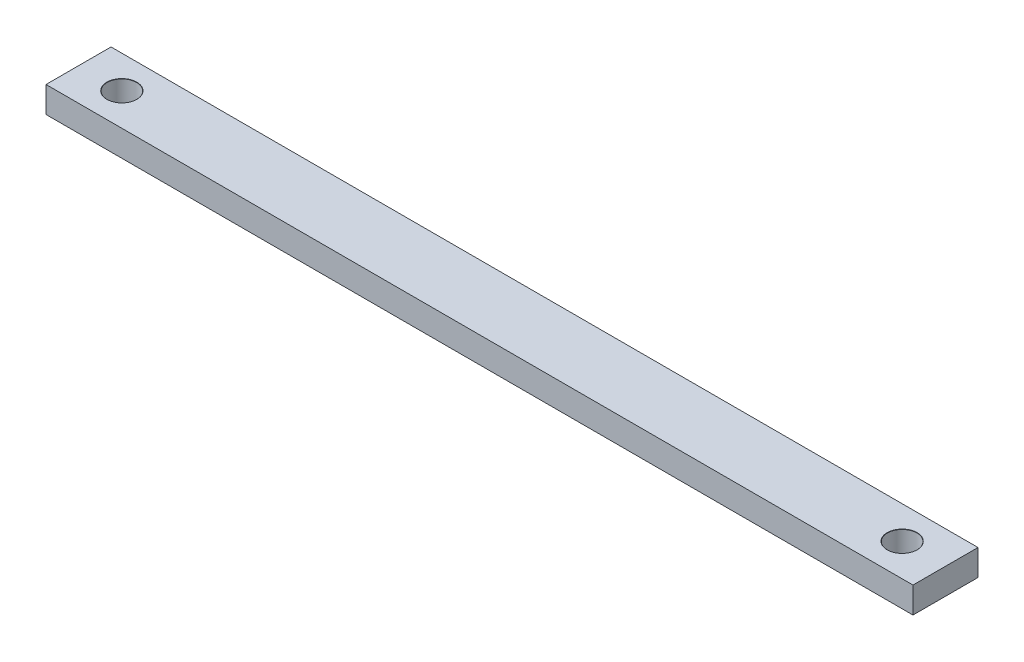
ISO-10303-21;
HEADER;
FILE_DESCRIPTION(('STEP AP214'),'2;1');
FILE_NAME('part.step','',(''),(''),'','','');
FILE_SCHEMA(('AUTOMOTIVE_DESIGN { 1 0 10303 214 1 1 1 1 }'));
ENDSEC;
DATA;
#1=APPLICATION_CONTEXT('core data for automotive mechanical design processes');
#2=APPLICATION_PROTOCOL_DEFINITION('international standard','automotive_design',2000,#1);
#3=PRODUCT_CONTEXT('',#1,'mechanical');
#4=PRODUCT('Part','Part','',(#3));
#5=PRODUCT_RELATED_PRODUCT_CATEGORY('part','',(#4));
#6=PRODUCT_DEFINITION_FORMATION('','',#4);
#7=PRODUCT_DEFINITION_CONTEXT('part definition',#1,'design');
#8=PRODUCT_DEFINITION('design','',#6,#7);
#9=PRODUCT_DEFINITION_SHAPE('','',#8);
#10=(LENGTH_UNIT() NAMED_UNIT(*) SI_UNIT(.MILLI.,.METRE.));
#11=(NAMED_UNIT(*) PLANE_ANGLE_UNIT() SI_UNIT($,.RADIAN.));
#12=(NAMED_UNIT(*) SI_UNIT($,.STERADIAN.) SOLID_ANGLE_UNIT());
#13=UNCERTAINTY_MEASURE_WITH_UNIT(LENGTH_MEASURE(1.E-05),#10,'distance_accuracy_value','');
#14=(GEOMETRIC_REPRESENTATION_CONTEXT(3) GLOBAL_UNCERTAINTY_ASSIGNED_CONTEXT((#13)) GLOBAL_UNIT_ASSIGNED_CONTEXT((#10,
#11,#12)) REPRESENTATION_CONTEXT('',''));
#15=CARTESIAN_POINT('',(0.,0.,0.));
#16=DIRECTION('',(0.,0.,1.));
#17=DIRECTION('',(1.,0.,0.));
#18=AXIS2_PLACEMENT_3D('',#15,#16,#17);
#19=CARTESIAN_POINT('',(50.,3.,-3.75));
#20=DIRECTION('',(-1.,0.,0.));
#21=DIRECTION('',(0.,0.,1.));
#22=AXIS2_PLACEMENT_3D('',#19,#20,#21);
#23=PLANE('',#22);
#24=DIRECTION('',(0.,0.,-1.));
#25=VECTOR('',#24,1.);
#26=CARTESIAN_POINT('',(50.,0.,-3.75));
#27=LINE('',#26,#25);
#28=CARTESIAN_POINT('',(50.,0.,3.75));
#29=VERTEX_POINT('',#28);
#30=CARTESIAN_POINT('',(50.,0.,-3.75));
#31=VERTEX_POINT('',#30);
#32=EDGE_CURVE('E102',#29,#31,#27,.T.);
#33=ORIENTED_EDGE('',*,*,#32,.T.);
#34=DIRECTION('',(0.,-1.,0.));
#35=VECTOR('',#34,1.);
#36=CARTESIAN_POINT('',(50.,3.,-3.75));
#37=LINE('',#36,#35);
#38=CARTESIAN_POINT('',(50.,3.,-3.75));
#39=VERTEX_POINT('',#38);
#40=EDGE_CURVE('E11',#39,#31,#37,.T.);
#41=ORIENTED_EDGE('',*,*,#40,.F.);
#42=DIRECTION('',(0.,0.,-1.));
#43=VECTOR('',#42,1.);
#44=CARTESIAN_POINT('',(50.,3.,-3.75));
#45=LINE('',#44,#43);
#46=CARTESIAN_POINT('',(50.,3.,3.75));
#47=VERTEX_POINT('',#46);
#48=EDGE_CURVE('E90',#47,#39,#45,.T.);
#49=ORIENTED_EDGE('',*,*,#48,.F.);
#50=DIRECTION('',(0.,-1.,0.));
#51=VECTOR('',#50,1.);
#52=CARTESIAN_POINT('',(50.,3.,3.75));
#53=LINE('',#52,#51);
#54=EDGE_CURVE('E98',#47,#29,#53,.T.);
#55=ORIENTED_EDGE('',*,*,#54,.T.);
#56=EDGE_LOOP('',(#33,#41,#49,#55));
#57=FACE_BOUND('',#56,.T.);
#58=ADVANCED_FACE('F39',(#57),#23,.F.);
#59=CARTESIAN_POINT('',(-50.,3.,-3.75));
#60=DIRECTION('',(0.,0.,1.));
#61=DIRECTION('',(1.,0.,0.));
#62=AXIS2_PLACEMENT_3D('',#59,#60,#61);
#63=PLANE('',#62);
#64=DIRECTION('',(-1.,0.,0.));
#65=VECTOR('',#64,1.);
#66=CARTESIAN_POINT('',(-50.,0.,-3.75));
#67=LINE('',#66,#65);
#68=CARTESIAN_POINT('',(-50.,0.,-3.75));
#69=VERTEX_POINT('',#68);
#70=EDGE_CURVE('E94',#31,#69,#67,.T.);
#71=ORIENTED_EDGE('',*,*,#70,.T.);
#72=DIRECTION('',(0.,-1.,0.));
#73=VECTOR('',#72,1.);
#74=CARTESIAN_POINT('',(-50.,3.,-3.75));
#75=LINE('',#74,#73);
#76=CARTESIAN_POINT('',(-50.,3.,-3.75));
#77=VERTEX_POINT('',#76);
#78=EDGE_CURVE('E47',#77,#69,#75,.T.);
#79=ORIENTED_EDGE('',*,*,#78,.F.);
#80=DIRECTION('',(-1.,0.,0.));
#81=VECTOR('',#80,1.);
#82=CARTESIAN_POINT('',(-50.,3.,-3.75));
#83=LINE('',#82,#81);
#84=EDGE_CURVE('E85',#39,#77,#83,.T.);
#85=ORIENTED_EDGE('',*,*,#84,.F.);
#86=ORIENTED_EDGE('',*,*,#40,.T.);
#87=EDGE_LOOP('',(#71,#79,#85,#86));
#88=FACE_BOUND('',#87,.T.);
#89=ADVANCED_FACE('F93',(#88),#63,.F.);
#90=CARTESIAN_POINT('',(-50.,3.,-3.75));
#91=DIRECTION('',(1.,0.,0.));
#92=DIRECTION('',(0.,0.,-1.));
#93=AXIS2_PLACEMENT_3D('',#90,#91,#92);
#94=PLANE('',#93);
#95=DIRECTION('',(0.,0.,1.));
#96=VECTOR('',#95,1.);
#97=CARTESIAN_POINT('',(-50.,0.,-3.75));
#98=LINE('',#97,#96);
#99=CARTESIAN_POINT('',(-50.,0.,3.75));
#100=VERTEX_POINT('',#99);
#101=EDGE_CURVE('E72',#69,#100,#98,.T.);
#102=ORIENTED_EDGE('',*,*,#101,.T.);
#103=DIRECTION('',(0.,-1.,0.));
#104=VECTOR('',#103,1.);
#105=CARTESIAN_POINT('',(-50.,3.,3.75));
#106=LINE('',#105,#104);
#107=CARTESIAN_POINT('',(-50.,3.,3.75));
#108=VERTEX_POINT('',#107);
#109=EDGE_CURVE('E95',#108,#100,#106,.T.);
#110=ORIENTED_EDGE('',*,*,#109,.F.);
#111=DIRECTION('',(0.,0.,1.));
#112=VECTOR('',#111,1.);
#113=CARTESIAN_POINT('',(-50.,3.,-3.75));
#114=LINE('',#113,#112);
#115=EDGE_CURVE('E88',#77,#108,#114,.T.);
#116=ORIENTED_EDGE('',*,*,#115,.F.);
#117=ORIENTED_EDGE('',*,*,#78,.T.);
#118=EDGE_LOOP('',(#102,#110,#116,#117));
#119=FACE_BOUND('',#118,.T.);
#120=ADVANCED_FACE('F96',(#119),#94,.F.);
#121=CARTESIAN_POINT('',(-50.,3.,3.75));
#122=DIRECTION('',(0.,0.,-1.));
#123=DIRECTION('',(-1.,0.,0.));
#124=AXIS2_PLACEMENT_3D('',#121,#122,#123);
#125=PLANE('',#124);
#126=DIRECTION('',(1.,0.,0.));
#127=VECTOR('',#126,1.);
#128=CARTESIAN_POINT('',(-50.,0.,3.75));
#129=LINE('',#128,#127);
#130=EDGE_CURVE('E78',#100,#29,#129,.T.);
#131=ORIENTED_EDGE('',*,*,#130,.T.);
#132=ORIENTED_EDGE('',*,*,#54,.F.);
#133=DIRECTION('',(1.,0.,0.));
#134=VECTOR('',#133,1.);
#135=CARTESIAN_POINT('',(-50.,3.,3.75));
#136=LINE('',#135,#134);
#137=EDGE_CURVE('E55',#108,#47,#136,.T.);
#138=ORIENTED_EDGE('',*,*,#137,.F.);
#139=ORIENTED_EDGE('',*,*,#109,.T.);
#140=EDGE_LOOP('',(#131,#132,#138,#139));
#141=FACE_BOUND('',#140,.T.);
#142=ADVANCED_FACE('F110',(#141),#125,.F.);
#143=CARTESIAN_POINT('',(0.,3.,0.));
#144=DIRECTION('',(0.,1.,0.));
#145=DIRECTION('',(0.,0.,1.));
#146=AXIS2_PLACEMENT_3D('',#143,#144,#145);
#147=PLANE('',#146);
#148=CARTESIAN_POINT('',(-45.,3.,0.));
#149=DIRECTION('',(0.,1.,0.));
#150=DIRECTION('',(0.,0.,1.));
#151=AXIS2_PLACEMENT_3D('',#148,#149,#150);
#152=CIRCLE('',#151,1.725);
#153=CARTESIAN_POINT('',(-45.,3.,1.725));
#154=VERTEX_POINT('',#153);
#155=EDGE_CURVE('E130',#154,#154,#152,.T.);
#156=ORIENTED_EDGE('',*,*,#155,.F.);
#157=EDGE_LOOP('',(#156));
#158=FACE_BOUND('',#157,.T.);
#159=CARTESIAN_POINT('',(45.,3.,0.));
#160=DIRECTION('',(0.,1.,0.));
#161=DIRECTION('',(0.,0.,1.));
#162=AXIS2_PLACEMENT_3D('',#159,#160,#161);
#163=CIRCLE('',#162,1.725);
#164=CARTESIAN_POINT('',(45.,3.,1.725));
#165=VERTEX_POINT('',#164);
#166=EDGE_CURVE('E121',#165,#165,#163,.T.);
#167=ORIENTED_EDGE('',*,*,#166,.F.);
#168=EDGE_LOOP('',(#167));
#169=FACE_BOUND('',#168,.T.);
#170=ORIENTED_EDGE('',*,*,#48,.T.);
#171=ORIENTED_EDGE('',*,*,#84,.T.);
#172=ORIENTED_EDGE('',*,*,#115,.T.);
#173=ORIENTED_EDGE('',*,*,#137,.T.);
#174=EDGE_LOOP('',(#170,#171,#172,#173));
#175=FACE_BOUND('',#174,.T.);
#176=ADVANCED_FACE('F86',(#158,#169,#175),#147,.T.);
#177=CARTESIAN_POINT('',(0.,0.,0.));
#178=DIRECTION('',(0.,1.,0.));
#179=DIRECTION('',(0.,0.,1.));
#180=AXIS2_PLACEMENT_3D('',#177,#178,#179);
#181=PLANE('',#180);
#182=CARTESIAN_POINT('',(-45.,0.,0.));
#183=DIRECTION('',(0.,1.,0.));
#184=DIRECTION('',(0.,0.,1.));
#185=AXIS2_PLACEMENT_3D('',#182,#183,#184);
#186=CIRCLE('',#185,1.7);
#187=CARTESIAN_POINT('',(-45.,0.,1.7));
#188=VERTEX_POINT('',#187);
#189=EDGE_CURVE('E124',#188,#188,#186,.T.);
#190=ORIENTED_EDGE('',*,*,#189,.T.);
#191=EDGE_LOOP('',(#190));
#192=FACE_BOUND('',#191,.T.);
#193=CARTESIAN_POINT('',(45.,0.,0.));
#194=DIRECTION('',(0.,1.,0.));
#195=DIRECTION('',(0.,0.,1.));
#196=AXIS2_PLACEMENT_3D('',#193,#194,#195);
#197=CIRCLE('',#196,1.7);
#198=CARTESIAN_POINT('',(45.,0.,1.7));
#199=VERTEX_POINT('',#198);
#200=EDGE_CURVE('E105',#199,#199,#197,.T.);
#201=ORIENTED_EDGE('',*,*,#200,.T.);
#202=EDGE_LOOP('',(#201));
#203=FACE_BOUND('',#202,.T.);
#204=ORIENTED_EDGE('',*,*,#32,.F.);
#205=ORIENTED_EDGE('',*,*,#130,.F.);
#206=ORIENTED_EDGE('',*,*,#101,.F.);
#207=ORIENTED_EDGE('',*,*,#70,.F.);
#208=EDGE_LOOP('',(#204,#205,#206,#207));
#209=FACE_BOUND('',#208,.T.);
#210=ADVANCED_FACE('F113',(#192,#203,#209),#181,.F.);
#211=CARTESIAN_POINT('',(45.,3.,0.));
#212=DIRECTION('',(0.,1.,0.));
#213=DIRECTION('',(0.,0.,1.));
#214=AXIS2_PLACEMENT_3D('',#211,#212,#213);
#215=CYLINDRICAL_SURFACE('',#214,1.7);
#216=ORIENTED_EDGE('',*,*,#200,.F.);
#217=EDGE_LOOP('',(#216));
#218=FACE_BOUND('',#217,.T.);
#219=CARTESIAN_POINT('',(45.,2.97499999999999,0.));
#220=DIRECTION('',(0.,1.,0.));
#221=DIRECTION('',(0.,0.,1.));
#222=AXIS2_PLACEMENT_3D('',#219,#220,#221);
#223=CIRCLE('',#222,1.7);
#224=CARTESIAN_POINT('',(45.,2.97499999999999,1.7));
#225=VERTEX_POINT('',#224);
#226=EDGE_CURVE('E118',#225,#225,#223,.T.);
#227=ORIENTED_EDGE('',*,*,#226,.T.);
#228=EDGE_LOOP('',(#227));
#229=FACE_BOUND('',#228,.T.);
#230=ADVANCED_FACE('F144',(#218,#229),#215,.F.);
#231=CARTESIAN_POINT('',(45.,3.,0.));
#232=DIRECTION('',(0.,1.,0.));
#233=DIRECTION('',(0.,0.,1.));
#234=AXIS2_PLACEMENT_3D('',#231,#232,#233);
#235=CONICAL_SURFACE('',#234,1.725,0.785398163397379);
#236=ORIENTED_EDGE('',*,*,#226,.F.);
#237=EDGE_LOOP('',(#236));
#238=FACE_BOUND('',#237,.T.);
#239=ORIENTED_EDGE('',*,*,#166,.T.);
#240=EDGE_LOOP('',(#239));
#241=FACE_BOUND('',#240,.T.);
#242=ADVANCED_FACE('F141',(#238,#241),#235,.F.);
#243=CARTESIAN_POINT('',(-45.,3.,0.));
#244=DIRECTION('',(0.,1.,0.));
#245=DIRECTION('',(0.,0.,1.));
#246=AXIS2_PLACEMENT_3D('',#243,#244,#245);
#247=CYLINDRICAL_SURFACE('',#246,1.7);
#248=ORIENTED_EDGE('',*,*,#189,.F.);
#249=EDGE_LOOP('',(#248));
#250=FACE_BOUND('',#249,.T.);
#251=CARTESIAN_POINT('',(-45.,2.97499999999999,0.));
#252=DIRECTION('',(0.,1.,0.));
#253=DIRECTION('',(0.,0.,1.));
#254=AXIS2_PLACEMENT_3D('',#251,#252,#253);
#255=CIRCLE('',#254,1.7);
#256=CARTESIAN_POINT('',(-45.,2.97499999999999,1.7));
#257=VERTEX_POINT('',#256);
#258=EDGE_CURVE('E127',#257,#257,#255,.T.);
#259=ORIENTED_EDGE('',*,*,#258,.T.);
#260=EDGE_LOOP('',(#259));
#261=FACE_BOUND('',#260,.T.);
#262=ADVANCED_FACE('F143',(#250,#261),#247,.F.);
#263=CARTESIAN_POINT('',(-45.,3.,0.));
#264=DIRECTION('',(0.,1.,0.));
#265=DIRECTION('',(0.,0.,1.));
#266=AXIS2_PLACEMENT_3D('',#263,#264,#265);
#267=CONICAL_SURFACE('',#266,1.725,0.785398163397379);
#268=ORIENTED_EDGE('',*,*,#258,.F.);
#269=EDGE_LOOP('',(#268));
#270=FACE_BOUND('',#269,.T.);
#271=ORIENTED_EDGE('',*,*,#155,.T.);
#272=EDGE_LOOP('',(#271));
#273=FACE_BOUND('',#272,.T.);
#274=ADVANCED_FACE('F134',(#270,#273),#267,.F.);
#275=CLOSED_SHELL('',(#58,#89,#120,#142,#176,#210,#230,#242,#262,#274));
#276=MANIFOLD_SOLID_BREP('B2',#275);
#277=ADVANCED_BREP_SHAPE_REPRESENTATION('',(#18,#276),#14);
#278=SHAPE_DEFINITION_REPRESENTATION(#9,#277);
ENDSEC;
END-ISO-10303-21;
